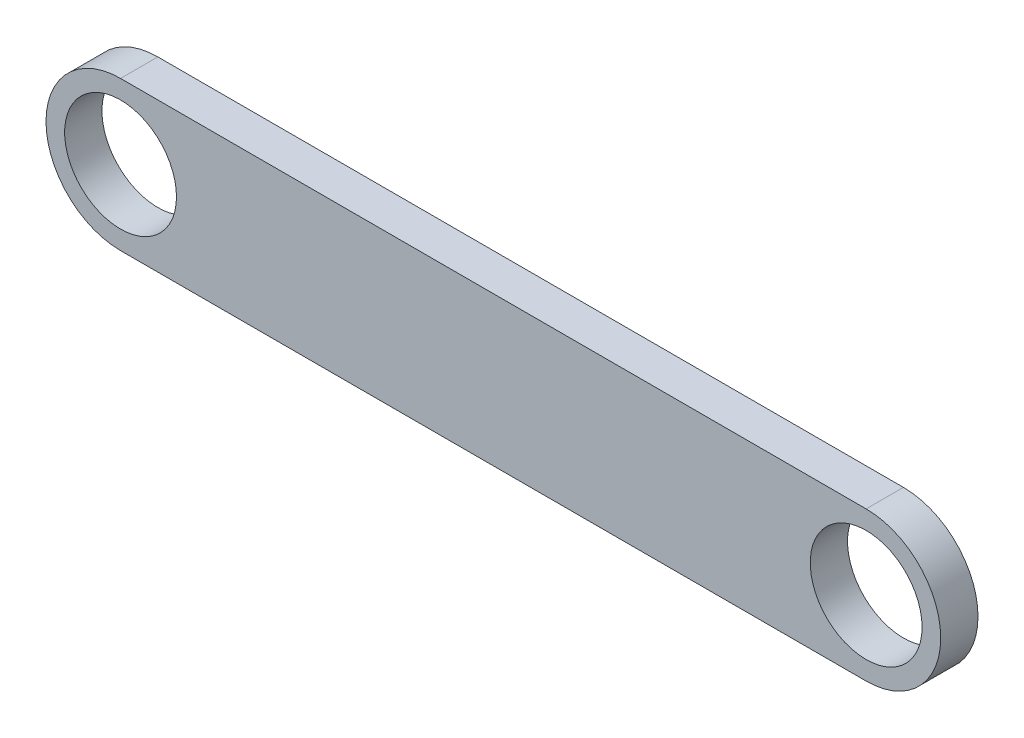
ISO-10303-21;
HEADER;
FILE_DESCRIPTION(('STEP AP214'),'2;1');
FILE_NAME('part.step','',(''),(''),'','','');
FILE_SCHEMA(('AUTOMOTIVE_DESIGN { 1 0 10303 214 1 1 1 1 }'));
ENDSEC;
DATA;
#1=APPLICATION_CONTEXT('core data for automotive mechanical design processes');
#2=APPLICATION_PROTOCOL_DEFINITION('international standard','automotive_design',2000,#1);
#3=PRODUCT_CONTEXT('',#1,'mechanical');
#4=PRODUCT('Part','Part','',(#3));
#5=PRODUCT_RELATED_PRODUCT_CATEGORY('part','',(#4));
#6=PRODUCT_DEFINITION_FORMATION('','',#4);
#7=PRODUCT_DEFINITION_CONTEXT('part definition',#1,'design');
#8=PRODUCT_DEFINITION('design','',#6,#7);
#9=PRODUCT_DEFINITION_SHAPE('','',#8);
#10=(LENGTH_UNIT() NAMED_UNIT(*) SI_UNIT(.MILLI.,.METRE.));
#11=(NAMED_UNIT(*) PLANE_ANGLE_UNIT() SI_UNIT($,.RADIAN.));
#12=(NAMED_UNIT(*) SI_UNIT($,.STERADIAN.) SOLID_ANGLE_UNIT());
#13=UNCERTAINTY_MEASURE_WITH_UNIT(LENGTH_MEASURE(1.E-05),#10,'distance_accuracy_value','');
#14=(GEOMETRIC_REPRESENTATION_CONTEXT(3) GLOBAL_UNCERTAINTY_ASSIGNED_CONTEXT((#13)) GLOBAL_UNIT_ASSIGNED_CONTEXT((#10,
#11,#12)) REPRESENTATION_CONTEXT('',''));
#15=CARTESIAN_POINT('',(0.,0.,0.));
#16=DIRECTION('',(0.,0.,1.));
#17=DIRECTION('',(1.,0.,0.));
#18=AXIS2_PLACEMENT_3D('',#15,#16,#17);
#19=CARTESIAN_POINT('',(-25.1566523322223,2.26150941146933,1.));
#20=DIRECTION('',(0.,0.,1.));
#21=DIRECTION('',(1.,0.,0.));
#22=AXIS2_PLACEMENT_3D('',#19,#20,#21);
#23=PLANE('',#22);
#24=CARTESIAN_POINT('',(-25.1566523322223,2.26150941146933,1.));
#25=DIRECTION('',(0.,0.,1.));
#26=DIRECTION('',(1.,0.,0.));
#27=AXIS2_PLACEMENT_3D('',#24,#25,#26);
#28=CIRCLE('',#27,1.5);
#29=CARTESIAN_POINT('',(-23.6566523322223,2.26150941146933,1.));
#30=VERTEX_POINT('',#29);
#31=EDGE_CURVE('E116',#30,#30,#28,.T.);
#32=ORIENTED_EDGE('',*,*,#31,.F.);
#33=EDGE_LOOP('',(#32));
#34=FACE_BOUND('',#33,.T.);
#35=CARTESIAN_POINT('',(-25.1566523322223,2.26150941146933,1.));
#36=DIRECTION('',(0.,0.,1.));
#37=DIRECTION('',(1.,0.,0.));
#38=AXIS2_PLACEMENT_3D('',#35,#36,#37);
#39=CIRCLE('',#38,2.);
#40=CARTESIAN_POINT('',(-25.1566523322223,4.26150941146933,1.));
#41=VERTEX_POINT('',#40);
#42=CARTESIAN_POINT('',(-25.1566523322223,0.261509411469324,1.));
#43=VERTEX_POINT('',#42);
#44=EDGE_CURVE('E94',#41,#43,#39,.T.);
#45=ORIENTED_EDGE('',*,*,#44,.T.);
#46=DIRECTION('',(1.,0.,0.));
#47=VECTOR('',#46,1.);
#48=CARTESIAN_POINT('',(-25.1566523322223,0.261509411469324,1.));
#49=LINE('',#48,#47);
#50=CARTESIAN_POINT('',(-5.15665233222228,0.261509411469326,1.));
#51=VERTEX_POINT('',#50);
#52=EDGE_CURVE('E89',#43,#51,#49,.T.);
#53=ORIENTED_EDGE('',*,*,#52,.T.);
#54=CARTESIAN_POINT('',(-5.15665233222228,2.26150941146933,1.));
#55=DIRECTION('',(0.,0.,1.));
#56=DIRECTION('',(1.,0.,0.));
#57=AXIS2_PLACEMENT_3D('',#54,#55,#56);
#58=CIRCLE('',#57,2.);
#59=CARTESIAN_POINT('',(-5.15665233222228,4.26150941146933,1.));
#60=VERTEX_POINT('',#59);
#61=EDGE_CURVE('E92',#51,#60,#58,.T.);
#62=ORIENTED_EDGE('',*,*,#61,.T.);
#63=DIRECTION('',(-1.,0.,0.));
#64=VECTOR('',#63,1.);
#65=CARTESIAN_POINT('',(-25.1566523322223,4.26150941146933,1.));
#66=LINE('',#65,#64);
#67=EDGE_CURVE('E59',#60,#41,#66,.T.);
#68=ORIENTED_EDGE('',*,*,#67,.T.);
#69=EDGE_LOOP('',(#45,#53,#62,#68));
#70=FACE_BOUND('',#69,.T.);
#71=CARTESIAN_POINT('',(-5.15665233222228,2.26150941146933,1.));
#72=DIRECTION('',(0.,0.,1.));
#73=DIRECTION('',(1.,0.,0.));
#74=AXIS2_PLACEMENT_3D('',#71,#72,#73);
#75=CIRCLE('',#74,1.5);
#76=CARTESIAN_POINT('',(-3.65665233222228,2.26150941146933,1.));
#77=VERTEX_POINT('',#76);
#78=EDGE_CURVE('E138',#77,#77,#75,.T.);
#79=ORIENTED_EDGE('',*,*,#78,.F.);
#80=EDGE_LOOP('',(#79));
#81=FACE_BOUND('',#80,.T.);
#82=ADVANCED_FACE('F41',(#34,#70,#81),#23,.T.);
#83=CARTESIAN_POINT('',(-25.1566523322223,2.26150941146933,0.));
#84=DIRECTION('',(0.,0.,1.));
#85=DIRECTION('',(1.,0.,0.));
#86=AXIS2_PLACEMENT_3D('',#83,#84,#85);
#87=PLANE('',#86);
#88=CARTESIAN_POINT('',(-25.1566523322223,2.26150941146933,0.));
#89=DIRECTION('',(0.,0.,1.));
#90=DIRECTION('',(1.,0.,0.));
#91=AXIS2_PLACEMENT_3D('',#88,#89,#90);
#92=CIRCLE('',#91,2.);
#93=CARTESIAN_POINT('',(-25.1566523322223,4.26150941146933,0.));
#94=VERTEX_POINT('',#93);
#95=CARTESIAN_POINT('',(-25.1566523322223,0.261509411469324,0.));
#96=VERTEX_POINT('',#95);
#97=EDGE_CURVE('E112',#94,#96,#92,.T.);
#98=ORIENTED_EDGE('',*,*,#97,.F.);
#99=DIRECTION('',(-1.,0.,0.));
#100=VECTOR('',#99,1.);
#101=CARTESIAN_POINT('',(-25.1566523322223,4.26150941146933,0.));
#102=LINE('',#101,#100);
#103=CARTESIAN_POINT('',(-5.15665233222228,4.26150941146933,0.));
#104=VERTEX_POINT('',#103);
#105=EDGE_CURVE('E82',#104,#94,#102,.T.);
#106=ORIENTED_EDGE('',*,*,#105,.F.);
#107=CARTESIAN_POINT('',(-5.15665233222228,2.26150941146933,0.));
#108=DIRECTION('',(0.,0.,1.));
#109=DIRECTION('',(1.,0.,0.));
#110=AXIS2_PLACEMENT_3D('',#107,#108,#109);
#111=CIRCLE('',#110,2.);
#112=CARTESIAN_POINT('',(-5.15665233222228,0.261509411469326,0.));
#113=VERTEX_POINT('',#112);
#114=EDGE_CURVE('E76',#113,#104,#111,.T.);
#115=ORIENTED_EDGE('',*,*,#114,.F.);
#116=DIRECTION('',(1.,0.,0.));
#117=VECTOR('',#116,1.);
#118=CARTESIAN_POINT('',(-25.1566523322223,0.261509411469324,0.));
#119=LINE('',#118,#117);
#120=EDGE_CURVE('E99',#96,#113,#119,.T.);
#121=ORIENTED_EDGE('',*,*,#120,.F.);
#122=EDGE_LOOP('',(#98,#106,#115,#121));
#123=FACE_BOUND('',#122,.T.);
#124=CARTESIAN_POINT('',(-25.1566523322223,2.26150941146933,0.));
#125=DIRECTION('',(0.,0.,1.));
#126=DIRECTION('',(1.,0.,0.));
#127=AXIS2_PLACEMENT_3D('',#124,#125,#126);
#128=CIRCLE('',#127,1.5);
#129=CARTESIAN_POINT('',(-23.6566523322223,2.26150941146933,0.));
#130=VERTEX_POINT('',#129);
#131=EDGE_CURVE('E135',#130,#130,#128,.T.);
#132=ORIENTED_EDGE('',*,*,#131,.T.);
#133=EDGE_LOOP('',(#132));
#134=FACE_BOUND('',#133,.T.);
#135=CARTESIAN_POINT('',(-5.15665233222228,2.26150941146933,0.));
#136=DIRECTION('',(0.,0.,1.));
#137=DIRECTION('',(1.,0.,0.));
#138=AXIS2_PLACEMENT_3D('',#135,#136,#137);
#139=CIRCLE('',#138,1.5);
#140=CARTESIAN_POINT('',(-3.65665233222228,2.26150941146933,0.));
#141=VERTEX_POINT('',#140);
#142=EDGE_CURVE('E141',#141,#141,#139,.T.);
#143=ORIENTED_EDGE('',*,*,#142,.T.);
#144=EDGE_LOOP('',(#143));
#145=FACE_BOUND('',#144,.T.);
#146=ADVANCED_FACE('F129',(#123,#134,#145),#87,.F.);
#147=CARTESIAN_POINT('',(-25.1566523322223,2.26150941146933,1.));
#148=DIRECTION('',(0.,0.,-1.));
#149=DIRECTION('',(-1.,0.,0.));
#150=AXIS2_PLACEMENT_3D('',#147,#148,#149);
#151=CYLINDRICAL_SURFACE('',#150,2.);
#152=ORIENTED_EDGE('',*,*,#97,.T.);
#153=DIRECTION('',(0.,0.,-1.));
#154=VECTOR('',#153,1.);
#155=CARTESIAN_POINT('',(-25.1566523322223,0.261509411469324,1.));
#156=LINE('',#155,#154);
#157=EDGE_CURVE('E11',#43,#96,#156,.T.);
#158=ORIENTED_EDGE('',*,*,#157,.F.);
#159=ORIENTED_EDGE('',*,*,#44,.F.);
#160=DIRECTION('',(0.,0.,-1.));
#161=VECTOR('',#160,1.);
#162=CARTESIAN_POINT('',(-25.1566523322223,4.26150941146933,1.));
#163=LINE('',#162,#161);
#164=EDGE_CURVE('E108',#41,#94,#163,.T.);
#165=ORIENTED_EDGE('',*,*,#164,.T.);
#166=EDGE_LOOP('',(#152,#158,#159,#165));
#167=FACE_BOUND('',#166,.T.);
#168=ADVANCED_FACE('F43',(#167),#151,.T.);
#169=CARTESIAN_POINT('',(-25.1566523322223,0.261509411469324,1.));
#170=DIRECTION('',(0.,1.,0.));
#171=DIRECTION('',(-1.,0.,0.));
#172=AXIS2_PLACEMENT_3D('',#169,#170,#171);
#173=PLANE('',#172);
#174=ORIENTED_EDGE('',*,*,#120,.T.);
#175=DIRECTION('',(0.,0.,-1.));
#176=VECTOR('',#175,1.);
#177=CARTESIAN_POINT('',(-5.15665233222228,0.261509411469326,1.));
#178=LINE('',#177,#176);
#179=EDGE_CURVE('E51',#51,#113,#178,.T.);
#180=ORIENTED_EDGE('',*,*,#179,.F.);
#181=ORIENTED_EDGE('',*,*,#52,.F.);
#182=ORIENTED_EDGE('',*,*,#157,.T.);
#183=EDGE_LOOP('',(#174,#180,#181,#182));
#184=FACE_BOUND('',#183,.T.);
#185=ADVANCED_FACE('F98',(#184),#173,.F.);
#186=CARTESIAN_POINT('',(-5.15665233222228,2.26150941146933,1.));
#187=DIRECTION('',(0.,0.,-1.));
#188=DIRECTION('',(-1.,0.,0.));
#189=AXIS2_PLACEMENT_3D('',#186,#187,#188);
#190=CYLINDRICAL_SURFACE('',#189,2.);
#191=ORIENTED_EDGE('',*,*,#114,.T.);
#192=DIRECTION('',(0.,0.,-1.));
#193=VECTOR('',#192,1.);
#194=CARTESIAN_POINT('',(-5.15665233222228,4.26150941146933,1.));
#195=LINE('',#194,#193);
#196=EDGE_CURVE('E101',#60,#104,#195,.T.);
#197=ORIENTED_EDGE('',*,*,#196,.F.);
#198=ORIENTED_EDGE('',*,*,#61,.F.);
#199=ORIENTED_EDGE('',*,*,#179,.T.);
#200=EDGE_LOOP('',(#191,#197,#198,#199));
#201=FACE_BOUND('',#200,.T.);
#202=ADVANCED_FACE('F102',(#201),#190,.T.);
#203=CARTESIAN_POINT('',(-25.1566523322223,4.26150941146933,1.));
#204=DIRECTION('',(0.,-1.,0.));
#205=DIRECTION('',(1.,0.,0.));
#206=AXIS2_PLACEMENT_3D('',#203,#204,#205);
#207=PLANE('',#206);
#208=ORIENTED_EDGE('',*,*,#105,.T.);
#209=ORIENTED_EDGE('',*,*,#164,.F.);
#210=ORIENTED_EDGE('',*,*,#67,.F.);
#211=ORIENTED_EDGE('',*,*,#196,.T.);
#212=EDGE_LOOP('',(#208,#209,#210,#211));
#213=FACE_BOUND('',#212,.T.);
#214=ADVANCED_FACE('F126',(#213),#207,.F.);
#215=CARTESIAN_POINT('',(-25.1566523322223,2.26150941146933,1.));
#216=DIRECTION('',(0.,0.,-1.));
#217=DIRECTION('',(-1.,0.,0.));
#218=AXIS2_PLACEMENT_3D('',#215,#216,#217);
#219=CYLINDRICAL_SURFACE('',#218,1.5);
#220=ORIENTED_EDGE('',*,*,#31,.T.);
#221=EDGE_LOOP('',(#220));
#222=FACE_BOUND('',#221,.T.);
#223=ORIENTED_EDGE('',*,*,#131,.F.);
#224=EDGE_LOOP('',(#223));
#225=FACE_BOUND('',#224,.T.);
#226=ADVANCED_FACE('F159',(#222,#225),#219,.F.);
#227=CARTESIAN_POINT('',(-5.15665233222228,2.26150941146933,1.));
#228=DIRECTION('',(0.,0.,-1.));
#229=DIRECTION('',(-1.,0.,0.));
#230=AXIS2_PLACEMENT_3D('',#227,#228,#229);
#231=CYLINDRICAL_SURFACE('',#230,1.5);
#232=ORIENTED_EDGE('',*,*,#78,.T.);
#233=EDGE_LOOP('',(#232));
#234=FACE_BOUND('',#233,.T.);
#235=ORIENTED_EDGE('',*,*,#142,.F.);
#236=EDGE_LOOP('',(#235));
#237=FACE_BOUND('',#236,.T.);
#238=ADVANCED_FACE('F148',(#234,#237),#231,.F.);
#239=CLOSED_SHELL('',(#82,#146,#168,#185,#202,#214,#226,#238));
#240=MANIFOLD_SOLID_BREP('B2',#239);
#241=ADVANCED_BREP_SHAPE_REPRESENTATION('',(#18,#240),#14);
#242=SHAPE_DEFINITION_REPRESENTATION(#9,#241);
ENDSEC;
END-ISO-10303-21;
